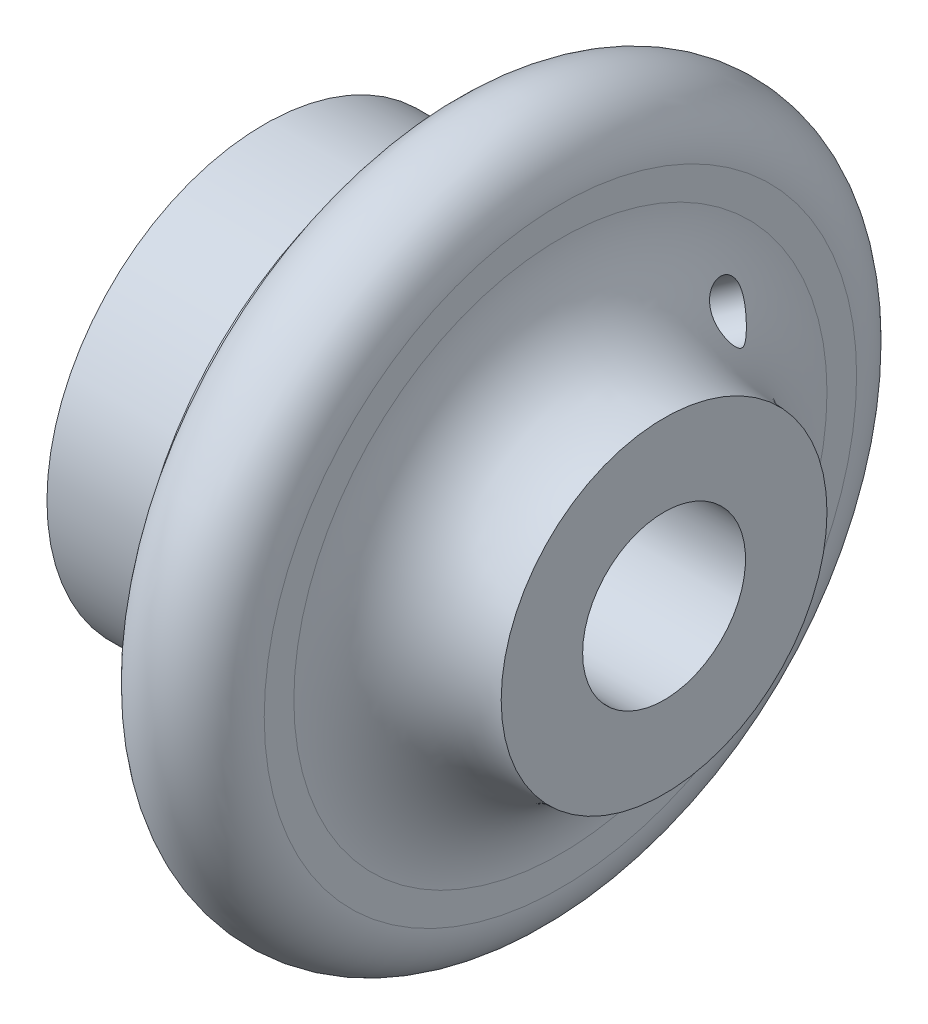
ISO-10303-21;
HEADER;
FILE_DESCRIPTION(('STEP AP214'),'2;1');
FILE_NAME('part.step','',(''),(''),'','','');
FILE_SCHEMA(('AUTOMOTIVE_DESIGN { 1 0 10303 214 1 1 1 1 }'));
ENDSEC;
DATA;
#1=APPLICATION_CONTEXT('core data for automotive mechanical design processes');
#2=APPLICATION_PROTOCOL_DEFINITION('international standard','automotive_design',2000,#1);
#3=PRODUCT_CONTEXT('',#1,'mechanical');
#4=PRODUCT('Part','Part','',(#3));
#5=PRODUCT_RELATED_PRODUCT_CATEGORY('part','',(#4));
#6=PRODUCT_DEFINITION_FORMATION('','',#4);
#7=PRODUCT_DEFINITION_CONTEXT('part definition',#1,'design');
#8=PRODUCT_DEFINITION('design','',#6,#7);
#9=PRODUCT_DEFINITION_SHAPE('','',#8);
#10=(LENGTH_UNIT() NAMED_UNIT(*) SI_UNIT(.MILLI.,.METRE.));
#11=(NAMED_UNIT(*) PLANE_ANGLE_UNIT() SI_UNIT($,.RADIAN.));
#12=(NAMED_UNIT(*) SI_UNIT($,.STERADIAN.) SOLID_ANGLE_UNIT());
#13=UNCERTAINTY_MEASURE_WITH_UNIT(LENGTH_MEASURE(1.E-05),#10,'distance_accuracy_value','');
#14=(GEOMETRIC_REPRESENTATION_CONTEXT(3) GLOBAL_UNCERTAINTY_ASSIGNED_CONTEXT((#13)) GLOBAL_UNIT_ASSIGNED_CONTEXT((#10,
#11,#12)) REPRESENTATION_CONTEXT('',''));
#15=CARTESIAN_POINT('',(0.,0.,0.));
#16=DIRECTION('',(0.,0.,1.));
#17=DIRECTION('',(1.,0.,0.));
#18=AXIS2_PLACEMENT_3D('',#15,#16,#17);
#19=CARTESIAN_POINT('',(0.,0.,0.));
#20=DIRECTION('',(-1.,0.,0.));
#21=DIRECTION('',(0.,0.,1.));
#22=AXIS2_PLACEMENT_3D('',#19,#20,#21);
#23=CYLINDRICAL_SURFACE('',#22,14.67);
#24=CARTESIAN_POINT('',(0.,0.,0.));
#25=DIRECTION('',(-1.,0.,0.));
#26=DIRECTION('',(0.,0.,1.));
#27=AXIS2_PLACEMENT_3D('',#24,#25,#26);
#28=CIRCLE('',#27,14.67);
#29=CARTESIAN_POINT('',(0.,0.,14.67));
#30=VERTEX_POINT('',#29);
#31=EDGE_CURVE('E83',#30,#30,#28,.T.);
#32=ORIENTED_EDGE('',*,*,#31,.F.);
#33=EDGE_LOOP('',(#32));
#34=FACE_BOUND('',#33,.T.);
#35=CARTESIAN_POINT('',(8.,0.,0.));
#36=DIRECTION('',(-1.,0.,0.));
#37=DIRECTION('',(0.,0.,1.));
#38=AXIS2_PLACEMENT_3D('',#35,#36,#37);
#39=CIRCLE('',#38,14.67);
#40=CARTESIAN_POINT('',(8.,0.,14.67));
#41=VERTEX_POINT('',#40);
#42=EDGE_CURVE('E50',#41,#41,#39,.T.);
#43=ORIENTED_EDGE('',*,*,#42,.T.);
#44=EDGE_LOOP('',(#43));
#45=FACE_BOUND('',#44,.T.);
#46=ADVANCED_FACE('F37',(#34,#45),#23,.T.);
#47=CARTESIAN_POINT('',(8.,14.67,0.));
#48=DIRECTION('',(-1.,0.,0.));
#49=DIRECTION('',(0.,0.,1.));
#50=AXIS2_PLACEMENT_3D('',#47,#48,#49);
#51=PLANE('',#50);
#52=ORIENTED_EDGE('',*,*,#42,.F.);
#53=EDGE_LOOP('',(#52));
#54=FACE_BOUND('',#53,.T.);
#55=CARTESIAN_POINT('',(8.,0.,0.));
#56=DIRECTION('',(-1.,0.,0.));
#57=DIRECTION('',(0.,0.,1.));
#58=AXIS2_PLACEMENT_3D('',#55,#56,#57);
#59=CIRCLE('',#58,13.17);
#60=CARTESIAN_POINT('',(8.,0.,13.17));
#61=VERTEX_POINT('',#60);
#62=EDGE_CURVE('E86',#61,#61,#59,.T.);
#63=ORIENTED_EDGE('',*,*,#62,.T.);
#64=EDGE_LOOP('',(#63));
#65=FACE_BOUND('',#64,.T.);
#66=ADVANCED_FACE('F73',(#54,#65),#51,.F.);
#67=CARTESIAN_POINT('',(0.,0.,0.));
#68=DIRECTION('',(-1.,0.,0.));
#69=DIRECTION('',(0.,0.,1.));
#70=AXIS2_PLACEMENT_3D('',#67,#68,#69);
#71=CYLINDRICAL_SURFACE('',#70,13.17);
#72=ORIENTED_EDGE('',*,*,#62,.F.);
#73=EDGE_LOOP('',(#72));
#74=FACE_BOUND('',#73,.T.);
#75=CARTESIAN_POINT('',(11.,0.,0.));
#76=DIRECTION('',(-1.,0.,0.));
#77=DIRECTION('',(0.,0.,1.));
#78=AXIS2_PLACEMENT_3D('',#75,#76,#77);
#79=CIRCLE('',#78,13.17);
#80=CARTESIAN_POINT('',(11.,0.,13.17));
#81=VERTEX_POINT('',#80);
#82=EDGE_CURVE('E88',#81,#81,#79,.T.);
#83=ORIENTED_EDGE('',*,*,#82,.T.);
#84=EDGE_LOOP('',(#83));
#85=FACE_BOUND('',#84,.T.);
#86=ADVANCED_FACE('F78',(#74,#85),#71,.T.);
#87=CARTESIAN_POINT('',(11.,13.17,0.));
#88=DIRECTION('',(1.,0.,0.));
#89=DIRECTION('',(0.,0.,-1.));
#90=AXIS2_PLACEMENT_3D('',#87,#88,#89);
#91=PLANE('',#90);
#92=ORIENTED_EDGE('',*,*,#82,.F.);
#93=EDGE_LOOP('',(#92));
#94=FACE_BOUND('',#93,.T.);
#95=CARTESIAN_POINT('',(11.,0.,0.));
#96=DIRECTION('',(-1.,0.,0.));
#97=DIRECTION('',(0.,0.,1.));
#98=AXIS2_PLACEMENT_3D('',#95,#96,#97);
#99=CIRCLE('',#98,20.);
#100=CARTESIAN_POINT('',(11.,0.,20.));
#101=VERTEX_POINT('',#100);
#102=EDGE_CURVE('E93',#101,#101,#99,.T.);
#103=ORIENTED_EDGE('',*,*,#102,.T.);
#104=EDGE_LOOP('',(#103));
#105=FACE_BOUND('',#104,.T.);
#106=ADVANCED_FACE('F159',(#94,#105),#91,.F.);
#107=CARTESIAN_POINT('',(0.,0.,0.));
#108=DIRECTION('',(-1.,0.,0.));
#109=DIRECTION('',(0.,0.,1.));
#110=AXIS2_PLACEMENT_3D('',#107,#108,#109);
#111=CYLINDRICAL_SURFACE('',#110,20.);
#112=ORIENTED_EDGE('',*,*,#102,.F.);
#113=EDGE_LOOP('',(#112));
#114=FACE_BOUND('',#113,.T.);
#115=CARTESIAN_POINT('',(12.,0.,0.));
#116=DIRECTION('',(-1.,0.,0.));
#117=DIRECTION('',(0.,0.,1.));
#118=AXIS2_PLACEMENT_3D('',#115,#116,#117);
#119=CIRCLE('',#118,20.);
#120=CARTESIAN_POINT('',(12.,0.,20.));
#121=VERTEX_POINT('',#120);
#122=EDGE_CURVE('E96',#121,#121,#119,.T.);
#123=ORIENTED_EDGE('',*,*,#122,.T.);
#124=EDGE_LOOP('',(#123));
#125=FACE_BOUND('',#124,.T.);
#126=ADVANCED_FACE('F155',(#114,#125),#111,.T.);
#127=CARTESIAN_POINT('',(16.,0.,0.));
#128=DIRECTION('',(-1.,0.,0.));
#129=DIRECTION('',(0.,0.,1.));
#130=AXIS2_PLACEMENT_3D('',#127,#128,#129);
#131=TOROIDAL_SURFACE('',#130,20.,4.);
#132=ORIENTED_EDGE('',*,*,#122,.F.);
#133=EDGE_LOOP('',(#132));
#134=FACE_BOUND('',#133,.T.);
#135=CARTESIAN_POINT('',(20.,0.,0.));
#136=DIRECTION('',(-1.,0.,0.));
#137=DIRECTION('',(0.,0.,1.));
#138=AXIS2_PLACEMENT_3D('',#135,#136,#137);
#139=CIRCLE('',#138,20.);
#140=CARTESIAN_POINT('',(20.,0.,20.));
#141=VERTEX_POINT('',#140);
#142=EDGE_CURVE('E99',#141,#141,#139,.T.);
#143=ORIENTED_EDGE('',*,*,#142,.T.);
#144=EDGE_LOOP('',(#143));
#145=FACE_BOUND('',#144,.T.);
#146=ADVANCED_FACE('F151',(#134,#145),#131,.T.);
#147=CARTESIAN_POINT('',(20.,20.,0.));
#148=DIRECTION('',(-1.,0.,0.));
#149=DIRECTION('',(0.,0.,1.));
#150=AXIS2_PLACEMENT_3D('',#147,#148,#149);
#151=PLANE('',#150);
#152=ORIENTED_EDGE('',*,*,#142,.F.);
#153=EDGE_LOOP('',(#152));
#154=FACE_BOUND('',#153,.T.);
#155=CARTESIAN_POINT('',(20.,0.,0.));
#156=DIRECTION('',(-1.,0.,0.));
#157=DIRECTION('',(0.,0.,1.));
#158=AXIS2_PLACEMENT_3D('',#155,#156,#157);
#159=CIRCLE('',#158,18.);
#160=CARTESIAN_POINT('',(20.,0.,18.));
#161=VERTEX_POINT('',#160);
#162=EDGE_CURVE('E102',#161,#161,#159,.T.);
#163=ORIENTED_EDGE('',*,*,#162,.T.);
#164=EDGE_LOOP('',(#163));
#165=FACE_BOUND('',#164,.T.);
#166=ADVANCED_FACE('F147',(#154,#165),#151,.F.);
#167=CARTESIAN_POINT('',(27.,0.,0.));
#168=DIRECTION('',(-1.,0.,0.));
#169=DIRECTION('',(0.,0.,1.));
#170=AXIS2_PLACEMENT_3D('',#167,#168,#169);
#171=TOROIDAL_SURFACE('',#170,18.,7.);
#172=CARTESIAN_POINT('',(21.0835019295099,8.53141310084668,-11.4251559045323));
#173=CARTESIAN_POINT('',(21.1305291390698,8.45397688563309,-11.390156294141));
#174=CARTESIAN_POINT('',(21.1806524882583,8.3810570014258,-11.3493548048483));
#175=CARTESIAN_POINT('',(21.2864193637467,8.24663313794472,-11.2574461504862));
#176=CARTESIAN_POINT('',(21.3420600665365,8.18512336533288,-11.2063442429768));
#177=CARTESIAN_POINT('',(21.4577674265147,8.07547314872064,-11.0953529537134));
#178=CARTESIAN_POINT('',(21.5178387696441,8.0273471238147,-11.0354541999149));
#179=CARTESIAN_POINT('',(21.6406815966501,7.94598867269117,-10.9087103972258));
#180=CARTESIAN_POINT('',(21.7034532900421,7.9127574044234,-10.841864808771));
#181=CARTESIAN_POINT('',(21.8289592746704,7.86213933930623,-10.7038085283346));
#182=CARTESIAN_POINT('',(21.8916868889247,7.8445880861094,-10.6326517084485));
#183=CARTESIAN_POINT('',(22.0155857439231,7.82466340908782,-10.4869491705173));
#184=CARTESIAN_POINT('',(22.0767566705609,7.82229302462682,-10.4124027768538));
#185=CARTESIAN_POINT('',(22.1975587923984,7.83233238359541,-10.2583910513456));
#186=CARTESIAN_POINT('',(22.2570415299676,7.845311093728,-10.1788466444763));
#187=CARTESIAN_POINT('',(22.3693931034599,7.88595570785997,-10.0188179703937));
#188=CARTESIAN_POINT('',(22.4222595942532,7.91362680146032,-9.93833338092188));
#189=CARTESIAN_POINT('',(22.5209239327729,7.98385285752606,-9.77414965220353));
#190=CARTESIAN_POINT('',(22.5663241486204,8.02699227066742,-9.69045981219328));
#191=CARTESIAN_POINT('',(22.6444393822071,8.12614287922682,-9.52479392514546));
#192=CARTESIAN_POINT('',(22.6771581107149,8.18215030164543,-9.44281738342699));
#193=CARTESIAN_POINT('',(22.7268832522736,8.30327516172299,-9.28463469188325));
#194=CARTESIAN_POINT('',(22.7443022282475,8.36809513457899,-9.20833138899764));
#195=CARTESIAN_POINT('',(22.7636015293025,8.50571740428155,-9.06117359440052));
#196=CARTESIAN_POINT('',(22.7654885012738,8.5785162730584,-8.99031678473542));
#197=CARTESIAN_POINT('',(22.7539422915102,8.72527859338196,-8.86023429724103));
#198=CARTESIAN_POINT('',(22.7413950225332,8.79892725025782,-8.80057154625637));
#199=CARTESIAN_POINT('',(22.703296760691,8.949289195795,-8.68989963355579));
#200=CARTESIAN_POINT('',(22.6777439470655,9.02600291217476,-8.63889168483509));
#201=CARTESIAN_POINT('',(22.6148470358333,9.18186434760998,-8.54655045980224));
#202=CARTESIAN_POINT('',(22.5773570598043,9.26103061622158,-8.50534852560272));
#203=CARTESIAN_POINT('',(22.4927700370467,9.41953695683676,-8.43484764714603));
#204=CARTESIAN_POINT('',(22.4456697881689,9.49887707802853,-8.40555268005816));
#205=CARTESIAN_POINT('',(22.3409396707304,9.6614967620811,-8.35866264979571));
#206=CARTESIAN_POINT('',(22.2828379772024,9.74471553417583,-8.34190572754696));
#207=CARTESIAN_POINT('',(22.161038243308,9.90872810422707,-8.32439373318809));
#208=CARTESIAN_POINT('',(22.0973397529228,9.98952170648211,-8.32363994901896));
#209=CARTESIAN_POINT('',(21.9663506257799,10.1480114394799,-8.33908565240823));
#210=CARTESIAN_POINT('',(21.8990280232268,10.2256633654515,-8.35547295686374));
#211=CARTESIAN_POINT('',(21.764262275668,10.3749496206062,-8.40576515445716));
#212=CARTESIAN_POINT('',(21.6968191885312,10.4465863060667,-8.43966315077776));
#213=CARTESIAN_POINT('',(21.5676501583689,10.5783816711407,-8.52224376193655));
#214=CARTESIAN_POINT('',(21.5058060782749,10.6389311311184,-8.57011908607686));
#215=CARTESIAN_POINT('',(21.3862112420994,10.7508141410068,-8.67972764034261));
#216=CARTESIAN_POINT('',(21.328460042338,10.8021486907677,-8.74145936536215));
#217=CARTESIAN_POINT('',(21.2197754836577,10.892839485287,-8.87502390400297));
#218=CARTESIAN_POINT('',(21.1687091996741,10.9324596990719,-8.94657036111411));
#219=CARTESIAN_POINT('',(21.0725210175704,11.000183355575,-9.09854833620399));
#220=CARTESIAN_POINT('',(21.0274000146675,11.0282850652232,-9.17898118891689));
#221=CARTESIAN_POINT('',(20.942090425433,11.0727548246412,-9.34896026026355));
#222=CARTESIAN_POINT('',(20.9021088906551,11.0887134194023,-9.43871725467858));
#223=CARTESIAN_POINT('',(20.8288979402029,11.1066323524186,-9.62229981297244));
#224=CARTESIAN_POINT('',(20.7956702978618,11.1085890188638,-9.71612643756569));
#225=CARTESIAN_POINT('',(20.7346106036666,11.0977701865259,-9.9089584710317));
#226=CARTESIAN_POINT('',(20.7070558326466,11.0843870021228,-10.0080184236614));
#227=CARTESIAN_POINT('',(20.6589062786284,11.0416128929198,-10.2043717073698));
#228=CARTESIAN_POINT('',(20.6383114489765,11.0122220754254,-10.3016650502863));
#229=CARTESIAN_POINT('',(20.6039434892477,10.9377536919917,-10.490859018104));
#230=CARTESIAN_POINT('',(20.5901414790514,10.8927439488608,-10.5827809830928));
#231=CARTESIAN_POINT('',(20.5690825650115,10.7878016432997,-10.7584913749175));
#232=CARTESIAN_POINT('',(20.5618235668099,10.7278738638395,-10.8422823967246));
#233=CARTESIAN_POINT('',(20.5539317492772,10.5974071853368,-10.9956003403049));
#234=CARTESIAN_POINT('',(20.5530384863429,10.5274065866807,-11.0655724278742));
#235=CARTESIAN_POINT('',(20.5571813148363,10.3771662334738,-11.1932639516214));
#236=CARTESIAN_POINT('',(20.5622168369839,10.2969274626488,-11.2509845635542));
#237=CARTESIAN_POINT('',(20.5781171195878,10.1303016233759,-11.3517667364255));
#238=CARTESIAN_POINT('',(20.5888726135394,10.0440553089702,-11.3950791147665));
#239=CARTESIAN_POINT('',(20.6162455844627,9.8667620575907,-11.4677537371847));
#240=CARTESIAN_POINT('',(20.6328636278591,9.77571465747129,-11.4971146326614));
#241=CARTESIAN_POINT('',(20.6726946278411,9.58878833027881,-11.5423334571425));
#242=CARTESIAN_POINT('',(20.6960863467016,9.49284598473883,-11.5577710908682));
#243=CARTESIAN_POINT('',(20.749457483677,9.3015238028468,-11.5738760928111));
#244=CARTESIAN_POINT('',(20.779440345424,9.20614428740112,-11.5745357214501));
#245=CARTESIAN_POINT('',(20.8496610469877,9.00898938565643,-11.5609110241617));
#246=CARTESIAN_POINT('',(20.8906414789524,8.90758168988622,-11.5450640064131));
#247=CARTESIAN_POINT('',(20.9809257173973,8.71265653663452,-11.4970087453588));
#248=CARTESIAN_POINT('',(21.030227105729,8.61913679864583,-11.4648052499527));
#249=CARTESIAN_POINT('',(21.0835019295099,8.53141310084668,-11.4251559045323));
#250=B_SPLINE_CURVE_WITH_KNOTS('',3,(#172,#173,#174,#175,#176,#177,#178,#179,#180,#181,#182,
#183,#184,#185,#186,#187,#188,#189,#190,#191,#192,#193,#194,#195,#196,#197,#198,#199,#200,#201,
#202,#203,#204,#205,#206,#207,#208,#209,#210,#211,#212,#213,#214,#215,#216,#217,#218,#219,#220,
#221,#222,#223,#224,#225,#226,#227,#228,#229,#230,#231,#232,#233,#234,#235,#236,#237,#238,#239,
#240,#241,#242,#243,#244,#245,#246,#247,#248,#249),.UNSPECIFIED.,.T.,.F.,(4,2,2,2,2,2,2,2,2,2,2,
2,2,2,2,2,2,2,2,2,2,2,2,2,2,2,2,2,2,2,2,2,2,2,2,2,2,2,4),(0.,0.291006477655116,
0.581864793638041,0.873035264939865,1.16422836852414,1.45233023181313,1.74048977421192,
2.03967447742771,2.3389649281635,2.65101983010112,2.96298335164092,3.26625077561694,
3.56938841015085,3.8548699553632,4.14039147863772,4.42954554543241,4.71879611635375,
5.02598280772335,5.33319422154621,5.64380740358932,5.95429833970038,6.24955026830262,
6.54477014164288,6.83271609987681,7.12070536646278,7.41802090390985,7.7154144053422,
8.02500858245813,8.33460068426584,8.64286491282342,8.95103043376687,9.24651145902126,
9.54196411459171,9.83196552358886,10.1219949594683,10.4205118231322,10.7191850232305,
11.0489476849816,11.3786146790747),.UNSPECIFIED.);
#251=CARTESIAN_POINT('',(21.0835019295099,8.53141310084668,-11.4251559045323));
#252=VERTEX_POINT('',#251);
#253=EDGE_CURVE('E115',#252,#252,#250,.T.);
#254=ORIENTED_EDGE('',*,*,#253,.T.);
#255=EDGE_LOOP('',(#254));
#256=FACE_BOUND('',#255,.T.);
#257=ORIENTED_EDGE('',*,*,#162,.F.);
#258=EDGE_LOOP('',(#257));
#259=FACE_BOUND('',#258,.T.);
#260=CARTESIAN_POINT('',(27.,0.,0.));
#261=DIRECTION('',(-1.,0.,0.));
#262=DIRECTION('',(0.,0.,1.));
#263=AXIS2_PLACEMENT_3D('',#260,#261,#262);
#264=CIRCLE('',#263,11.);
#265=CARTESIAN_POINT('',(27.,0.,11.));
#266=VERTEX_POINT('',#265);
#267=EDGE_CURVE('E105',#266,#266,#264,.T.);
#268=ORIENTED_EDGE('',*,*,#267,.T.);
#269=EDGE_LOOP('',(#268));
#270=FACE_BOUND('',#269,.T.);
#271=ADVANCED_FACE('F143',(#256,#259,#270),#171,.F.);
#272=CARTESIAN_POINT('',(27.,11.,0.));
#273=DIRECTION('',(-1.,0.,0.));
#274=DIRECTION('',(0.,0.,1.));
#275=AXIS2_PLACEMENT_3D('',#272,#273,#274);
#276=PLANE('',#275);
#277=ORIENTED_EDGE('',*,*,#267,.F.);
#278=EDGE_LOOP('',(#277));
#279=FACE_BOUND('',#278,.T.);
#280=CARTESIAN_POINT('',(27.,0.,0.));
#281=DIRECTION('',(-1.,0.,0.));
#282=DIRECTION('',(0.,0.,1.));
#283=AXIS2_PLACEMENT_3D('',#280,#281,#282);
#284=CIRCLE('',#283,5.5);
#285=CARTESIAN_POINT('',(27.,0.,5.5));
#286=VERTEX_POINT('',#285);
#287=EDGE_CURVE('E108',#286,#286,#284,.T.);
#288=ORIENTED_EDGE('',*,*,#287,.T.);
#289=EDGE_LOOP('',(#288));
#290=FACE_BOUND('',#289,.T.);
#291=ADVANCED_FACE('F138',(#279,#290),#276,.F.);
#292=CARTESIAN_POINT('',(0.,0.,0.));
#293=DIRECTION('',(-1.,0.,0.));
#294=DIRECTION('',(0.,0.,1.));
#295=AXIS2_PLACEMENT_3D('',#292,#293,#294);
#296=CYLINDRICAL_SURFACE('',#295,5.5);
#297=CARTESIAN_POINT('',(12.7892188067694,2.74149361712713,-4.76804076610626));
#298=CARTESIAN_POINT('',(12.721990730284,2.7898554525178,-4.74022949233621));
#299=CARTESIAN_POINT('',(12.655270258575,2.83833971112311,-4.71137753781704));
#300=CARTESIAN_POINT('',(12.522958330497,2.93563928086992,-4.65137668507068));
#301=CARTESIAN_POINT('',(12.4573685403803,2.98445495368695,-4.62022470386722));
#302=CARTESIAN_POINT('',(12.3256050717239,3.08388950369375,-4.5544795789925));
#303=CARTESIAN_POINT('',(12.2594763399637,3.1345173629009,-4.51980968960657));
#304=CARTESIAN_POINT('',(12.1291794733821,3.23614227657217,-4.44761445246391));
#305=CARTESIAN_POINT('',(12.0650096404428,3.28713896096204,-4.4100916823409));
#306=CARTESIAN_POINT('',(11.9718904277169,3.36344382557835,-4.35180698146493));
#307=CARTESIAN_POINT('',(11.9418456858756,3.38843536728417,-4.33238201132584));
#308=CARTESIAN_POINT('',(11.8826416388516,3.43877630669016,-4.29253426440322));
#309=CARTESIAN_POINT('',(11.8534835986601,3.4641261464157,-4.27211016142575));
#310=CARTESIAN_POINT('',(11.7966908369897,3.51525131227527,-4.23014190935197));
#311=CARTESIAN_POINT('',(11.7690490421647,3.54102377391555,-4.20860407193074));
#312=CARTESIAN_POINT('',(11.7295153060098,3.58045311345224,-4.175003146187));
#313=CARTESIAN_POINT('',(11.7166711499437,3.59371059077339,-4.16359957558589));
#314=CARTESIAN_POINT('',(11.6919370518248,3.62060808905024,-4.14023122642181));
#315=CARTESIAN_POINT('',(11.6800465498728,3.63424787910338,-4.12826678378809));
#316=CARTESIAN_POINT('',(11.6568566437638,3.66316706835465,-4.10263459036359));
#317=CARTESIAN_POINT('',(11.6456765923,3.6784911903675,-4.08890683510883));
#318=CARTESIAN_POINT('',(11.6263272679142,3.70995366704068,-4.06038041235528));
#319=CARTESIAN_POINT('',(11.6181396643558,3.72608635166175,-4.04558895266159));
#320=CARTESIAN_POINT('',(11.6085948248205,3.75376748788705,-4.0198831853649));
#321=CARTESIAN_POINT('',(11.6058832972938,3.76510477077787,-4.0092682635651));
#322=CARTESIAN_POINT('',(11.6032880422899,3.78785719274957,-3.98777904028475));
#323=CARTESIAN_POINT('',(11.603401274424,3.79927223490161,-3.976905030268));
#324=CARTESIAN_POINT('',(11.6064144931612,3.82175925384551,-3.95530015141598));
#325=CARTESIAN_POINT('',(11.6093040964501,3.83283235026521,-3.94456890023938));
#326=CARTESIAN_POINT('',(11.6172983459821,3.85447941630459,-3.9234192677512));
#327=CARTESIAN_POINT('',(11.6224085803103,3.86505205161922,-3.91300174711099));
#328=CARTESIAN_POINT('',(11.6365926040069,3.88985617480907,-3.88837210869896));
#329=CARTESIAN_POINT('',(11.6464328591046,3.90382063950657,-3.87434581607656));
#330=CARTESIAN_POINT('',(11.6679494027334,3.93089935637691,-3.84686928186076));
#331=CARTESIAN_POINT('',(11.6796303152357,3.94401134657068,-3.83342060260552));
#332=CARTESIAN_POINT('',(11.7042235000189,3.96967980113546,-3.80683413367876));
#333=CARTESIAN_POINT('',(11.7171451504848,3.98223077920418,-3.79369983163848));
#334=CARTESIAN_POINT('',(11.7437330013061,4.00679691572647,-3.76774424315952));
#335=CARTESIAN_POINT('',(11.7573982575507,4.0188127199483,-3.75492258841543));
#336=CARTESIAN_POINT('',(11.8028491640246,4.05736608577283,-3.7133986772766));
#337=CARTESIAN_POINT('',(11.8357115104484,4.08306680063967,-3.68510296783659));
#338=CARTESIAN_POINT('',(11.9028985566743,4.13303200939356,-3.62897389366049));
#339=CARTESIAN_POINT('',(11.9372240662198,4.15729568977459,-3.60114079710302));
#340=CARTESIAN_POINT('',(12.0417793700965,4.22843530294467,-3.51790878293839));
#341=CARTESIAN_POINT('',(12.113479691437,4.27357417376327,-3.4628700123635));
#342=CARTESIAN_POINT('',(12.2590118810808,4.36005491470015,-3.35332019516406));
#343=CARTESIAN_POINT('',(12.332835583747,4.40140929194227,-3.29880798535003));
#344=CARTESIAN_POINT('',(12.4822870089037,4.48086405781184,-3.19004554518857));
#345=CARTESIAN_POINT('',(12.5579130901038,4.51896727230459,-3.13579512680694));
#346=CARTESIAN_POINT('',(12.6580922790864,4.56700054358084,-3.06478703125323));
#347=CARTESIAN_POINT('',(12.6819515112255,4.57826181347853,-3.04793795150509));
#348=CARTESIAN_POINT('',(12.7298051892594,4.60050094316227,-3.01426579442522));
#349=CARTESIAN_POINT('',(12.7537995831296,4.61147890397783,-2.99744270989307));
#350=CARTESIAN_POINT('',(12.7778633174924,4.62232046459661,-2.98062971913181));
#351=B_SPLINE_CURVE_WITH_KNOTS('',3,(#297,#298,#299,#300,#301,#302,#303,#304,#305,#306,#307,
#308,#309,#310,#311,#312,#313,#314,#315,#316,#317,#318,#319,#320,#321,#322,#323,#324,#325,#326,
#327,#328,#329,#330,#331,#332,#333,#334,#335,#336,#337,#338,#339,#340,#341,#342,#343,#344,#345,
#346,#347,#348,#349,#350),.UNSPECIFIED.,.F.,.F.,(4,2,2,2,2,2,2,2,2,2,2,2,2,2,2,2,2,2,2,2,2,2,2,
2,2,2,4),(0.,0.262088124743937,0.524534165879619,0.795117204674641,1.06545860707301,
1.19636675765427,1.32745365064933,1.45786527477542,1.52293692351819,1.5879700840844,
1.65809985628775,1.72779253887969,1.77487022300228,1.82189723793467,1.86874905897208,
1.91571946882869,1.98185259440673,2.04815458432033,2.11500449135572,2.18177141836511,
2.33290960816771,2.4841325552886,2.78707661479756,3.08898031948348,3.39061888223482,
3.48453146297118,3.57841007779271),.UNSPECIFIED.);
#352=CARTESIAN_POINT('',(12.7697586006243,2.75550275064524,-4.75995846527955));
#353=VERTEX_POINT('',#352);
#354=CARTESIAN_POINT('',(12.7697586006243,4.61866260593474,-2.98629464931712));
#355=VERTEX_POINT('',#354);
#356=EDGE_CURVE('E11',#353,#355,#351,.T.);
#357=ORIENTED_EDGE('',*,*,#356,.T.);
#358=CARTESIAN_POINT('',(12.7697586006243,4.61866260593474,-2.98629464931712));
#359=CARTESIAN_POINT('',(12.8363931968866,4.59977757399401,-3.01547809671796));
#360=CARTESIAN_POINT('',(12.9020917879269,4.57958888828574,-3.04611841582567));
#361=CARTESIAN_POINT('',(13.0312084151756,4.53594547164666,-3.11075041904175));
#362=CARTESIAN_POINT('',(13.0946109111867,4.51247237438524,-3.14476061151694));
#363=CARTESIAN_POINT('',(13.2191690038645,4.46130051050136,-3.21695304816466));
#364=CARTESIAN_POINT('',(13.2802539186118,4.43352635701762,-3.25520535394265));
#365=CARTESIAN_POINT('',(13.3972739514438,4.3734066597957,-3.33554049341669));
#366=CARTESIAN_POINT('',(13.4532221047754,4.34107324673447,-3.37761306018459));
#367=CARTESIAN_POINT('',(13.5478369453237,4.27769959167204,-3.45736146008163));
#368=CARTESIAN_POINT('',(13.5877511335238,4.24762394630403,-3.49430833052644));
#369=CARTESIAN_POINT('',(13.6612111424705,4.18351158166762,-3.57081401382441));
#370=CARTESIAN_POINT('',(13.694775724058,4.14948702641534,-3.61036465140872));
#371=CARTESIAN_POINT('',(13.7539279081781,4.07664110696443,-3.69243045204316));
#372=CARTESIAN_POINT('',(13.7793975152772,4.0377593687852,-3.73497931214055));
#373=CARTESIAN_POINT('',(13.8190446634054,3.95597928264244,-3.82148430941027));
#374=CARTESIAN_POINT('',(13.8332425415315,3.91308832540397,-3.86543776254007));
#375=CARTESIAN_POINT('',(13.84764244785,3.82908820906419,-3.94857153216961));
#376=CARTESIAN_POINT('',(13.8491083503441,3.78823361452966,-3.98778735505016));
#377=CARTESIAN_POINT('',(13.8411552569378,3.70589019986303,-4.06442403415919));
#378=CARTESIAN_POINT('',(13.8317313400499,3.66440110136854,-4.10184407093076));
#379=CARTESIAN_POINT('',(13.8049055530707,3.58733451629521,-4.16933305856986));
#380=CARTESIAN_POINT('',(13.7886158398784,3.55165275602038,-4.19974212708527));
#381=CARTESIAN_POINT('',(13.7497902888477,3.48166897317925,-4.25793991086075));
#382=CARTESIAN_POINT('',(13.7272568912074,3.44736641756837,-4.28572964415185));
#383=CARTESIAN_POINT('',(13.6596616660174,3.35707916000267,-4.35721078012916));
#384=CARTESIAN_POINT('',(13.6098635287539,3.30270247854225,-4.39843623319333));
#385=CARTESIAN_POINT('',(13.5004004353756,3.19902624594636,-4.47441697419827));
#386=CARTESIAN_POINT('',(13.4406655765157,3.14976699550767,-4.50912242366322));
#387=CARTESIAN_POINT('',(13.3315833373923,3.06885662691972,-4.56440824053047));
#388=CARTESIAN_POINT('',(13.2837366070217,3.03602212771508,-4.5862826657186));
#389=CARTESIAN_POINT('',(13.1853069832795,2.97286099016082,-4.62747464029902));
#390=CARTESIAN_POINT('',(13.1347217396512,2.94253656431386,-4.64678994277354));
#391=CARTESIAN_POINT('',(13.0325698252895,2.88488203542487,-4.68279702100925));
#392=CARTESIAN_POINT('',(12.9810481308012,2.85750130954491,-4.69953655269499));
#393=CARTESIAN_POINT('',(12.8764788661317,2.80492130313176,-4.73110341635864));
#394=CARTESIAN_POINT('',(12.8234348482363,2.77971741953441,-4.7459348174341));
#395=CARTESIAN_POINT('',(12.7697586006243,2.75550275064525,-4.75995846527955));
#396=B_SPLINE_CURVE_WITH_KNOTS('',3,(#358,#359,#360,#361,#362,#363,#364,#365,#366,#367,#368,
#369,#370,#371,#372,#373,#374,#375,#376,#377,#378,#379,#380,#381,#382,#383,#384,#385,#386,#387,
#388,#389,#390,#391,#392,#393,#394,#395),.UNSPECIFIED.,.F.,.F.,(4,2,2,2,2,2,2,2,2,2,2,2,2,2,2,2,
2,2,4),(0.,0.225533398375009,0.452382510662993,0.683786747843131,0.914586522064474,
1.10064045182446,1.28613576546005,1.47422258475099,1.66196927088867,1.83083572846686,
1.99977852475835,2.14813362832364,2.29643083234856,2.54840797340516,2.80223912837079,
2.98811284965956,3.17414870219186,3.35615582833559,3.53776815247665),.UNSPECIFIED.);
#397=EDGE_CURVE('E122',#355,#353,#396,.T.);
#398=ORIENTED_EDGE('',*,*,#397,.T.);
#399=EDGE_LOOP('',(#357,#398));
#400=FACE_BOUND('',#399,.T.);
#401=ORIENTED_EDGE('',*,*,#287,.F.);
#402=EDGE_LOOP('',(#401));
#403=FACE_BOUND('',#402,.T.);
#404=CARTESIAN_POINT('',(0.,0.,0.));
#405=DIRECTION('',(-1.,0.,0.));
#406=DIRECTION('',(0.,0.,1.));
#407=AXIS2_PLACEMENT_3D('',#404,#405,#406);
#408=CIRCLE('',#407,5.5);
#409=CARTESIAN_POINT('',(0.,0.,5.5));
#410=VERTEX_POINT('',#409);
#411=EDGE_CURVE('E111',#410,#410,#408,.T.);
#412=ORIENTED_EDGE('',*,*,#411,.T.);
#413=EDGE_LOOP('',(#412));
#414=FACE_BOUND('',#413,.T.);
#415=ADVANCED_FACE('F133',(#400,#403,#414),#296,.F.);
#416=CARTESIAN_POINT('',(0.,14.67,0.));
#417=DIRECTION('',(1.,0.,0.));
#418=DIRECTION('',(0.,0.,-1.));
#419=AXIS2_PLACEMENT_3D('',#416,#417,#418);
#420=PLANE('',#419);
#421=ORIENTED_EDGE('',*,*,#411,.F.);
#422=EDGE_LOOP('',(#421));
#423=FACE_BOUND('',#422,.T.);
#424=ORIENTED_EDGE('',*,*,#31,.T.);
#425=EDGE_LOOP('',(#424));
#426=FACE_BOUND('',#425,.T.);
#427=ADVANCED_FACE('F68',(#423,#426),#420,.F.);
#428=CARTESIAN_POINT('',(21.4726169295317,9.4494799980089,-9.92628457952609));
#429=DIRECTION('',(0.789626152924046,0.423067471154204,-0.44441473138225));
#430=DIRECTION('',(-0.490470834580267,0.,-0.871457606786547));
#431=AXIS2_PLACEMENT_3D('',#428,#429,#430);
#432=CYLINDRICAL_SURFACE('',#431,1.8);
#433=ORIENTED_EDGE('',*,*,#253,.F.);
#434=EDGE_LOOP('',(#433));
#435=FACE_BOUND('',#434,.T.);
#436=CARTESIAN_POINT('',(11.9971030944431,4.37267034415846,-4.59330780293909));
#437=DIRECTION('',(0.789626152924046,0.423067471154204,-0.44441473138225));
#438=DIRECTION('',(-0.490470834580267,0.,-0.871457606786547));
#439=AXIS2_PLACEMENT_3D('',#436,#437,#438);
#440=CIRCLE('',#439,1.8);
#441=EDGE_CURVE('E56',#353,#355,#440,.T.);
#442=ORIENTED_EDGE('',*,*,#441,.F.);
#443=ORIENTED_EDGE('',*,*,#397,.F.);
#444=EDGE_LOOP('',(#442,#443));
#445=FACE_BOUND('',#444,.T.);
#446=ADVANCED_FACE('F64',(#435,#445),#432,.F.);
#447=CARTESIAN_POINT('',(11.9971030944431,4.37267034415846,-4.59330780293909));
#448=DIRECTION('',(0.789626152924046,0.423067471154204,-0.44441473138225));
#449=DIRECTION('',(-0.490470834580267,0.,-0.871457606786547));
#450=AXIS2_PLACEMENT_3D('',#447,#448,#449);
#451=CONICAL_SURFACE('',#450,1.8,1.02974425867665);
#452=CARTESIAN_POINT('',(11.1430836281598,3.9151020954638,-4.11265144385314));
#453=VERTEX_POINT('',#452);
#454=VERTEX_LOOP('',#453);
#455=FACE_BOUND('',#454,.T.);
#456=ORIENTED_EDGE('',*,*,#441,.T.);
#457=ORIENTED_EDGE('',*,*,#356,.F.);
#458=EDGE_LOOP('',(#456,#457));
#459=FACE_BOUND('',#458,.T.);
#460=ADVANCED_FACE('F62',(#455,#459),#451,.F.);
#461=CLOSED_SHELL('',(#46,#66,#86,#106,#126,#146,#166,#271,#291,#415,#427,#446,#460));
#462=MANIFOLD_SOLID_BREP('B2',#461);
#463=ADVANCED_BREP_SHAPE_REPRESENTATION('',(#18,#462),#14);
#464=SHAPE_DEFINITION_REPRESENTATION(#9,#463);
ENDSEC;
END-ISO-10303-21;
